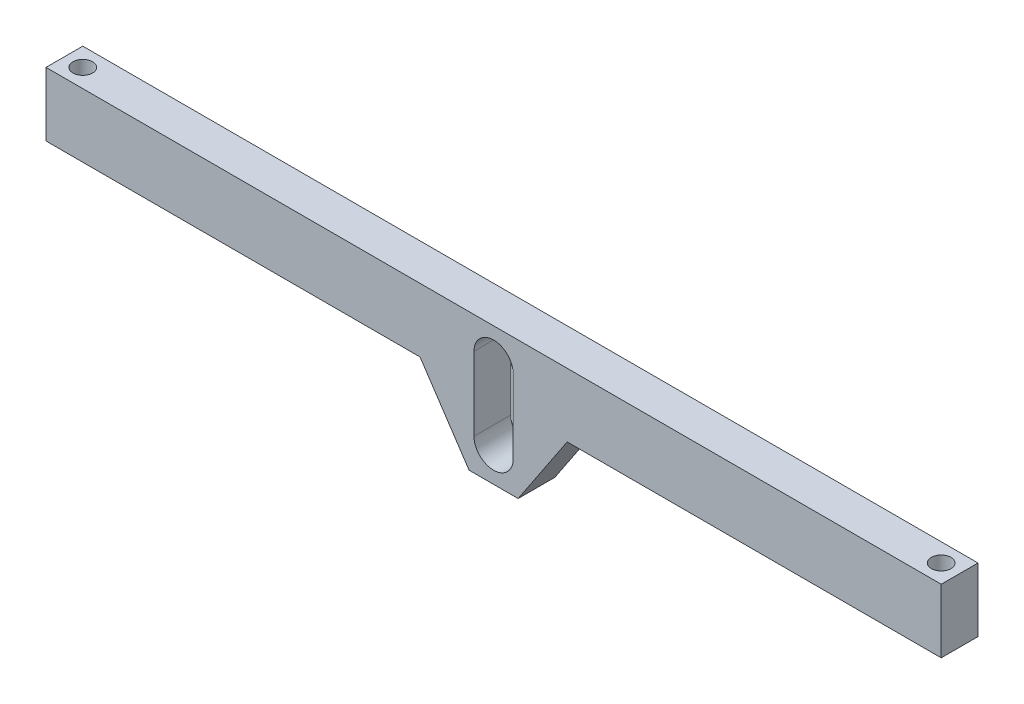
ISO-10303-21;
HEADER;
FILE_DESCRIPTION(('STEP AP214'),'2;1');
FILE_NAME('part.step','',(''),(''),'','','');
FILE_SCHEMA(('AUTOMOTIVE_DESIGN { 1 0 10303 214 1 1 1 1 }'));
ENDSEC;
DATA;
#1=APPLICATION_CONTEXT('core data for automotive mechanical design processes');
#2=APPLICATION_PROTOCOL_DEFINITION('international standard','automotive_design',2000,#1);
#3=PRODUCT_CONTEXT('',#1,'mechanical');
#4=PRODUCT('Part','Part','',(#3));
#5=PRODUCT_RELATED_PRODUCT_CATEGORY('part','',(#4));
#6=PRODUCT_DEFINITION_FORMATION('','',#4);
#7=PRODUCT_DEFINITION_CONTEXT('part definition',#1,'design');
#8=PRODUCT_DEFINITION('design','',#6,#7);
#9=PRODUCT_DEFINITION_SHAPE('','',#8);
#10=(LENGTH_UNIT() NAMED_UNIT(*) SI_UNIT(.MILLI.,.METRE.));
#11=(NAMED_UNIT(*) PLANE_ANGLE_UNIT() SI_UNIT($,.RADIAN.));
#12=(NAMED_UNIT(*) SI_UNIT($,.STERADIAN.) SOLID_ANGLE_UNIT());
#13=UNCERTAINTY_MEASURE_WITH_UNIT(LENGTH_MEASURE(1.E-05),#10,'distance_accuracy_value','');
#14=(GEOMETRIC_REPRESENTATION_CONTEXT(3) GLOBAL_UNCERTAINTY_ASSIGNED_CONTEXT((#13)) GLOBAL_UNIT_ASSIGNED_CONTEXT((#10,
#11,#12)) REPRESENTATION_CONTEXT('',''));
#15=CARTESIAN_POINT('',(0.,0.,0.));
#16=DIRECTION('',(0.,0.,1.));
#17=DIRECTION('',(1.,0.,0.));
#18=AXIS2_PLACEMENT_3D('',#15,#16,#17);
#19=CARTESIAN_POINT('',(-12.2207001177359,4.39098069496649,3.));
#20=DIRECTION('',(0.,0.,-1.));
#21=DIRECTION('',(-1.,0.,0.));
#22=AXIS2_PLACEMENT_3D('',#19,#20,#21);
#23=CYLINDRICAL_SURFACE('',#22,1.6);
#24=CARTESIAN_POINT('',(-12.2207001177359,4.39098069496649,0.));
#25=DIRECTION('',(0.,0.,1.));
#26=DIRECTION('',(1.,0.,0.));
#27=AXIS2_PLACEMENT_3D('',#24,#25,#26);
#28=CIRCLE('',#27,1.6);
#29=CARTESIAN_POINT('',(-10.6207001177358,4.39098069496649,0.));
#30=VERTEX_POINT('',#29);
#31=CARTESIAN_POINT('',(-13.8207001177359,4.39098069496649,0.));
#32=VERTEX_POINT('',#31);
#33=EDGE_CURVE('E177',#30,#32,#28,.T.);
#34=ORIENTED_EDGE('',*,*,#33,.F.);
#35=DIRECTION('',(0.,0.,-1.));
#36=VECTOR('',#35,1.);
#37=CARTESIAN_POINT('',(-10.6207001177358,4.39098069496649,3.));
#38=LINE('',#37,#36);
#39=CARTESIAN_POINT('',(-10.6207001177358,4.39098069496649,3.));
#40=VERTEX_POINT('',#39);
#41=EDGE_CURVE('E11',#40,#30,#38,.T.);
#42=ORIENTED_EDGE('',*,*,#41,.F.);
#43=CARTESIAN_POINT('',(-12.2207001177359,4.39098069496649,3.));
#44=DIRECTION('',(0.,0.,1.));
#45=DIRECTION('',(1.,0.,0.));
#46=AXIS2_PLACEMENT_3D('',#43,#44,#45);
#47=CIRCLE('',#46,1.6);
#48=CARTESIAN_POINT('',(-13.8207001177359,4.39098069496649,3.));
#49=VERTEX_POINT('',#48);
#50=EDGE_CURVE('E139',#40,#49,#47,.T.);
#51=ORIENTED_EDGE('',*,*,#50,.T.);
#52=DIRECTION('',(0.,0.,-1.));
#53=VECTOR('',#52,1.);
#54=CARTESIAN_POINT('',(-13.8207001177359,4.39098069496649,3.));
#55=LINE('',#54,#53);
#56=EDGE_CURVE('E100',#49,#32,#55,.T.);
#57=ORIENTED_EDGE('',*,*,#56,.T.);
#58=EDGE_LOOP('',(#34,#42,#51,#57));
#59=FACE_BOUND('',#58,.T.);
#60=ADVANCED_FACE('F35',(#59),#23,.F.);
#61=CARTESIAN_POINT('',(-10.6207001177359,0.,3.));
#62=DIRECTION('',(1.,0.,0.));
#63=DIRECTION('',(0.,1.,0.));
#64=AXIS2_PLACEMENT_3D('',#61,#62,#63);
#65=PLANE('',#64);
#66=DIRECTION('',(0.,-1.,0.));
#67=VECTOR('',#66,1.);
#68=CARTESIAN_POINT('',(-10.6207001177359,0.,0.));
#69=LINE('',#68,#67);
#70=CARTESIAN_POINT('',(-10.6207001177359,-1.60901930503351,0.));
#71=VERTEX_POINT('',#70);
#72=EDGE_CURVE('E145',#30,#71,#69,.T.);
#73=ORIENTED_EDGE('',*,*,#72,.T.);
#74=DIRECTION('',(0.,0.,-1.));
#75=VECTOR('',#74,1.);
#76=CARTESIAN_POINT('',(-10.6207001177359,-1.60901930503351,3.));
#77=LINE('',#76,#75);
#78=CARTESIAN_POINT('',(-10.6207001177359,-1.60901930503351,3.));
#79=VERTEX_POINT('',#78);
#80=EDGE_CURVE('E45',#79,#71,#77,.T.);
#81=ORIENTED_EDGE('',*,*,#80,.F.);
#82=DIRECTION('',(0.,-1.,0.));
#83=VECTOR('',#82,1.);
#84=CARTESIAN_POINT('',(-10.6207001177359,0.,3.));
#85=LINE('',#84,#83);
#86=EDGE_CURVE('E134',#40,#79,#85,.T.);
#87=ORIENTED_EDGE('',*,*,#86,.F.);
#88=ORIENTED_EDGE('',*,*,#41,.T.);
#89=EDGE_LOOP('',(#73,#81,#87,#88));
#90=FACE_BOUND('',#89,.T.);
#91=ADVANCED_FACE('F143',(#90),#65,.F.);
#92=CARTESIAN_POINT('',(-12.2207001177359,-1.60901930503351,3.));
#93=DIRECTION('',(0.,0.,-1.));
#94=DIRECTION('',(-1.,0.,0.));
#95=AXIS2_PLACEMENT_3D('',#92,#93,#94);
#96=CYLINDRICAL_SURFACE('',#95,1.6);
#97=CARTESIAN_POINT('',(-12.2207001177359,-1.60901930503351,0.));
#98=DIRECTION('',(0.,0.,1.));
#99=DIRECTION('',(1.,0.,0.));
#100=AXIS2_PLACEMENT_3D('',#97,#98,#99);
#101=CIRCLE('',#100,1.6);
#102=CARTESIAN_POINT('',(-13.8207001177359,-1.60901930503351,0.));
#103=VERTEX_POINT('',#102);
#104=EDGE_CURVE('E181',#103,#71,#101,.T.);
#105=ORIENTED_EDGE('',*,*,#104,.F.);
#106=DIRECTION('',(0.,0.,-1.));
#107=VECTOR('',#106,1.);
#108=CARTESIAN_POINT('',(-13.8207001177359,-1.60901930503351,3.));
#109=LINE('',#108,#107);
#110=CARTESIAN_POINT('',(-13.8207001177359,-1.60901930503351,3.));
#111=VERTEX_POINT('',#110);
#112=EDGE_CURVE('E93',#111,#103,#109,.T.);
#113=ORIENTED_EDGE('',*,*,#112,.F.);
#114=CARTESIAN_POINT('',(-12.2207001177359,-1.60901930503351,3.));
#115=DIRECTION('',(0.,0.,1.));
#116=DIRECTION('',(1.,0.,0.));
#117=AXIS2_PLACEMENT_3D('',#114,#115,#116);
#118=CIRCLE('',#117,1.6);
#119=EDGE_CURVE('E138',#111,#79,#118,.T.);
#120=ORIENTED_EDGE('',*,*,#119,.T.);
#121=ORIENTED_EDGE('',*,*,#80,.T.);
#122=EDGE_LOOP('',(#105,#113,#120,#121));
#123=FACE_BOUND('',#122,.T.);
#124=ADVANCED_FACE('F150',(#123),#96,.F.);
#125=CARTESIAN_POINT('',(-5.13324501764782,3.42216334509855,3.));
#126=DIRECTION('',(-0.832050294337844,0.554700196225229,0.));
#127=DIRECTION('',(-0.554700196225229,-0.832050294337844,0.));
#128=AXIS2_PLACEMENT_3D('',#125,#126,#127);
#129=PLANE('',#128);
#130=DIRECTION('',(0.554700196225229,0.832050294337844,0.));
#131=VECTOR('',#130,1.);
#132=CARTESIAN_POINT('',(-5.13324501764782,3.42216334509855,0.));
#133=LINE('',#132,#131);
#134=CARTESIAN_POINT('',(-10.2207001177359,-4.20901930503351,0.));
#135=VERTEX_POINT('',#134);
#136=CARTESIAN_POINT('',(-6.22070011773585,1.79098069496649,0.));
#137=VERTEX_POINT('',#136);
#138=EDGE_CURVE('E156',#135,#137,#133,.T.);
#139=ORIENTED_EDGE('',*,*,#138,.T.);
#140=DIRECTION('',(0.,0.,-1.));
#141=VECTOR('',#140,1.);
#142=CARTESIAN_POINT('',(-6.22070011773585,1.79098069496649,3.));
#143=LINE('',#142,#141);
#144=CARTESIAN_POINT('',(-6.22070011773585,1.79098069496649,3.));
#145=VERTEX_POINT('',#144);
#146=EDGE_CURVE('E39',#145,#137,#143,.T.);
#147=ORIENTED_EDGE('',*,*,#146,.F.);
#148=DIRECTION('',(0.554700196225229,0.832050294337844,0.));
#149=VECTOR('',#148,1.);
#150=CARTESIAN_POINT('',(-5.13324501764782,3.42216334509855,3.));
#151=LINE('',#150,#149);
#152=CARTESIAN_POINT('',(-10.2207001177359,-4.20901930503351,3.));
#153=VERTEX_POINT('',#152);
#154=EDGE_CURVE('E185',#153,#145,#151,.T.);
#155=ORIENTED_EDGE('',*,*,#154,.F.);
#156=DIRECTION('',(0.,0.,-1.));
#157=VECTOR('',#156,1.);
#158=CARTESIAN_POINT('',(-10.2207001177359,-4.20901930503351,3.));
#159=LINE('',#158,#157);
#160=EDGE_CURVE('E152',#153,#135,#159,.T.);
#161=ORIENTED_EDGE('',*,*,#160,.T.);
#162=EDGE_LOOP('',(#139,#147,#155,#161));
#163=FACE_BOUND('',#162,.T.);
#164=ADVANCED_FACE('F37',(#163),#129,.F.);
#165=CARTESIAN_POINT('',(0.,1.79098069496649,3.));
#166=DIRECTION('',(0.,1.,0.));
#167=DIRECTION('',(0.,0.,1.));
#168=AXIS2_PLACEMENT_3D('',#165,#166,#167);
#169=PLANE('',#168);
#170=CARTESIAN_POINT('',(22.7792998822641,1.79098069496649,1.5));
#171=DIRECTION('',(0.,-1.,0.));
#172=DIRECTION('',(0.,0.,-1.));
#173=AXIS2_PLACEMENT_3D('',#170,#171,#172);
#174=CIRCLE('',#173,0.799999999999999);
#175=CARTESIAN_POINT('',(22.7792998822641,1.79098069496649,0.700000000000001));
#176=VERTEX_POINT('',#175);
#177=EDGE_CURVE('E283',#176,#176,#174,.T.);
#178=ORIENTED_EDGE('',*,*,#177,.F.);
#179=EDGE_LOOP('',(#178));
#180=FACE_BOUND('',#179,.T.);
#181=DIRECTION('',(1.,0.,0.));
#182=VECTOR('',#181,1.);
#183=CARTESIAN_POINT('',(0.,1.79098069496649,0.));
#184=LINE('',#183,#182);
#185=CARTESIAN_POINT('',(24.2792998822641,1.79098069496649,0.));
#186=VERTEX_POINT('',#185);
#187=EDGE_CURVE('E159',#137,#186,#184,.T.);
#188=ORIENTED_EDGE('',*,*,#187,.T.);
#189=DIRECTION('',(0.,0.,-1.));
#190=VECTOR('',#189,1.);
#191=CARTESIAN_POINT('',(24.2792998822641,1.79098069496649,3.));
#192=LINE('',#191,#190);
#193=CARTESIAN_POINT('',(24.2792998822641,1.79098069496649,3.));
#194=VERTEX_POINT('',#193);
#195=EDGE_CURVE('E202',#194,#186,#192,.T.);
#196=ORIENTED_EDGE('',*,*,#195,.F.);
#197=DIRECTION('',(1.,0.,0.));
#198=VECTOR('',#197,1.);
#199=CARTESIAN_POINT('',(0.,1.79098069496649,3.));
#200=LINE('',#199,#198);
#201=EDGE_CURVE('E108',#145,#194,#200,.T.);
#202=ORIENTED_EDGE('',*,*,#201,.F.);
#203=ORIENTED_EDGE('',*,*,#146,.T.);
#204=EDGE_LOOP('',(#188,#196,#202,#203));
#205=FACE_BOUND('',#204,.T.);
#206=ADVANCED_FACE('F207',(#180,#205),#169,.F.);
#207=CARTESIAN_POINT('',(24.2792998822641,0.,3.));
#208=DIRECTION('',(1.,0.,0.));
#209=DIRECTION('',(0.,0.,-1.));
#210=AXIS2_PLACEMENT_3D('',#207,#208,#209);
#211=PLANE('',#210);
#212=DIRECTION('',(0.,-1.,0.));
#213=VECTOR('',#212,1.);
#214=CARTESIAN_POINT('',(24.2792998822641,0.,0.));
#215=LINE('',#214,#213);
#216=CARTESIAN_POINT('',(24.2792998822641,6.99098069496649,0.));
#217=VERTEX_POINT('',#216);
#218=EDGE_CURVE('E163',#217,#186,#215,.T.);
#219=ORIENTED_EDGE('',*,*,#218,.F.);
#220=DIRECTION('',(0.,0.,-1.));
#221=VECTOR('',#220,1.);
#222=CARTESIAN_POINT('',(24.2792998822641,6.99098069496649,3.));
#223=LINE('',#222,#221);
#224=CARTESIAN_POINT('',(24.2792998822641,6.99098069496649,3.));
#225=VERTEX_POINT('',#224);
#226=EDGE_CURVE('E201',#225,#217,#223,.T.);
#227=ORIENTED_EDGE('',*,*,#226,.F.);
#228=DIRECTION('',(0.,-1.,0.));
#229=VECTOR('',#228,1.);
#230=CARTESIAN_POINT('',(24.2792998822641,0.,3.));
#231=LINE('',#230,#229);
#232=EDGE_CURVE('E221',#225,#194,#231,.T.);
#233=ORIENTED_EDGE('',*,*,#232,.T.);
#234=ORIENTED_EDGE('',*,*,#195,.T.);
#235=EDGE_LOOP('',(#219,#227,#233,#234));
#236=FACE_BOUND('',#235,.T.);
#237=ADVANCED_FACE('F219',(#236),#211,.T.);
#238=CARTESIAN_POINT('',(0.,6.99098069496649,3.));
#239=DIRECTION('',(0.,1.,0.));
#240=DIRECTION('',(0.,0.,1.));
#241=AXIS2_PLACEMENT_3D('',#238,#239,#240);
#242=PLANE('',#241);
#243=CARTESIAN_POINT('',(-47.2207001177359,6.99098069496649,1.5));
#244=DIRECTION('',(0.,-1.,0.));
#245=DIRECTION('',(0.,0.,-1.));
#246=AXIS2_PLACEMENT_3D('',#243,#244,#245);
#247=CIRCLE('',#246,0.800000000000003);
#248=CARTESIAN_POINT('',(-47.2207001177359,6.99098069496649,0.699999999999997));
#249=VERTEX_POINT('',#248);
#250=EDGE_CURVE('E285',#249,#249,#247,.T.);
#251=ORIENTED_EDGE('',*,*,#250,.T.);
#252=EDGE_LOOP('',(#251));
#253=FACE_BOUND('',#252,.T.);
#254=CARTESIAN_POINT('',(22.7792998822641,6.99098069496649,1.5));
#255=DIRECTION('',(0.,-1.,0.));
#256=DIRECTION('',(0.,0.,-1.));
#257=AXIS2_PLACEMENT_3D('',#254,#255,#256);
#258=CIRCLE('',#257,0.799999999999999);
#259=CARTESIAN_POINT('',(22.7792998822641,6.99098069496649,0.700000000000001));
#260=VERTEX_POINT('',#259);
#261=EDGE_CURVE('E160',#260,#260,#258,.T.);
#262=ORIENTED_EDGE('',*,*,#261,.T.);
#263=EDGE_LOOP('',(#262));
#264=FACE_BOUND('',#263,.T.);
#265=DIRECTION('',(1.,0.,0.));
#266=VECTOR('',#265,1.);
#267=CARTESIAN_POINT('',(0.,6.99098069496649,0.));
#268=LINE('',#267,#266);
#269=CARTESIAN_POINT('',(-48.7207001177359,6.99098069496649,0.));
#270=VERTEX_POINT('',#269);
#271=EDGE_CURVE('E166',#270,#217,#268,.T.);
#272=ORIENTED_EDGE('',*,*,#271,.F.);
#273=DIRECTION('',(0.,0.,-1.));
#274=VECTOR('',#273,1.);
#275=CARTESIAN_POINT('',(-48.7207001177359,6.99098069496649,3.));
#276=LINE('',#275,#274);
#277=CARTESIAN_POINT('',(-48.7207001177359,6.99098069496649,3.));
#278=VERTEX_POINT('',#277);
#279=EDGE_CURVE('E199',#278,#270,#276,.T.);
#280=ORIENTED_EDGE('',*,*,#279,.F.);
#281=DIRECTION('',(1.,0.,0.));
#282=VECTOR('',#281,1.);
#283=CARTESIAN_POINT('',(0.,6.99098069496649,3.));
#284=LINE('',#283,#282);
#285=EDGE_CURVE('E226',#278,#225,#284,.T.);
#286=ORIENTED_EDGE('',*,*,#285,.T.);
#287=ORIENTED_EDGE('',*,*,#226,.T.);
#288=EDGE_LOOP('',(#272,#280,#286,#287));
#289=FACE_BOUND('',#288,.T.);
#290=ADVANCED_FACE('F228',(#253,#264,#289),#242,.T.);
#291=CARTESIAN_POINT('',(-48.7207001177359,0.,3.));
#292=DIRECTION('',(1.,0.,0.));
#293=DIRECTION('',(0.,0.,-1.));
#294=AXIS2_PLACEMENT_3D('',#291,#292,#293);
#295=PLANE('',#294);
#296=DIRECTION('',(0.,-1.,0.));
#297=VECTOR('',#296,1.);
#298=CARTESIAN_POINT('',(-48.7207001177359,0.,0.));
#299=LINE('',#298,#297);
#300=CARTESIAN_POINT('',(-48.7207001177359,1.79098069496649,0.));
#301=VERTEX_POINT('',#300);
#302=EDGE_CURVE('E169',#270,#301,#299,.T.);
#303=ORIENTED_EDGE('',*,*,#302,.T.);
#304=DIRECTION('',(0.,0.,-1.));
#305=VECTOR('',#304,1.);
#306=CARTESIAN_POINT('',(-48.7207001177359,1.79098069496649,3.));
#307=LINE('',#306,#305);
#308=CARTESIAN_POINT('',(-48.7207001177359,1.79098069496649,3.));
#309=VERTEX_POINT('',#308);
#310=EDGE_CURVE('E196',#309,#301,#307,.T.);
#311=ORIENTED_EDGE('',*,*,#310,.F.);
#312=DIRECTION('',(0.,-1.,0.));
#313=VECTOR('',#312,1.);
#314=CARTESIAN_POINT('',(-48.7207001177359,0.,3.));
#315=LINE('',#314,#313);
#316=EDGE_CURVE('E230',#278,#309,#315,.T.);
#317=ORIENTED_EDGE('',*,*,#316,.F.);
#318=ORIENTED_EDGE('',*,*,#279,.T.);
#319=EDGE_LOOP('',(#303,#311,#317,#318));
#320=FACE_BOUND('',#319,.T.);
#321=ADVANCED_FACE('F267',(#320),#295,.F.);
#322=CARTESIAN_POINT('',(0.,1.79098069496649,3.));
#323=DIRECTION('',(0.,1.,0.));
#324=DIRECTION('',(0.,0.,1.));
#325=AXIS2_PLACEMENT_3D('',#322,#323,#324);
#326=PLANE('',#325);
#327=CARTESIAN_POINT('',(-47.2207001177359,1.79098069496649,1.5));
#328=DIRECTION('',(0.,-1.,0.));
#329=DIRECTION('',(0.,0.,-1.));
#330=AXIS2_PLACEMENT_3D('',#327,#328,#329);
#331=CIRCLE('',#330,0.800000000000003);
#332=CARTESIAN_POINT('',(-47.2207001177359,1.79098069496649,0.699999999999997));
#333=VERTEX_POINT('',#332);
#334=EDGE_CURVE('E290',#333,#333,#331,.T.);
#335=ORIENTED_EDGE('',*,*,#334,.F.);
#336=EDGE_LOOP('',(#335));
#337=FACE_BOUND('',#336,.T.);
#338=DIRECTION('',(1.,0.,0.));
#339=VECTOR('',#338,1.);
#340=CARTESIAN_POINT('',(0.,1.79098069496649,0.));
#341=LINE('',#340,#339);
#342=CARTESIAN_POINT('',(-18.2207001177359,1.7909806949665,0.));
#343=VERTEX_POINT('',#342);
#344=EDGE_CURVE('E171',#301,#343,#341,.T.);
#345=ORIENTED_EDGE('',*,*,#344,.T.);
#346=DIRECTION('',(0.,0.,-1.));
#347=VECTOR('',#346,1.);
#348=CARTESIAN_POINT('',(-18.2207001177359,1.7909806949665,3.));
#349=LINE('',#348,#347);
#350=CARTESIAN_POINT('',(-18.2207001177359,1.7909806949665,3.));
#351=VERTEX_POINT('',#350);
#352=EDGE_CURVE('E193',#351,#343,#349,.T.);
#353=ORIENTED_EDGE('',*,*,#352,.F.);
#354=DIRECTION('',(1.,0.,0.));
#355=VECTOR('',#354,1.);
#356=CARTESIAN_POINT('',(0.,1.79098069496649,3.));
#357=LINE('',#356,#355);
#358=EDGE_CURVE('E232',#309,#351,#357,.T.);
#359=ORIENTED_EDGE('',*,*,#358,.F.);
#360=ORIENTED_EDGE('',*,*,#310,.T.);
#361=EDGE_LOOP('',(#345,#353,#359,#360));
#362=FACE_BOUND('',#361,.T.);
#363=ADVANCED_FACE('F263',(#337,#362),#326,.F.);
#364=CARTESIAN_POINT('',(-11.7877243761403,-7.85848291742686,3.));
#365=DIRECTION('',(0.832050294337843,0.554700196225229,0.));
#366=DIRECTION('',(-0.554700196225229,0.832050294337844,0.));
#367=AXIS2_PLACEMENT_3D('',#364,#365,#366);
#368=PLANE('',#367);
#369=DIRECTION('',(0.554700196225229,-0.832050294337844,0.));
#370=VECTOR('',#369,1.);
#371=CARTESIAN_POINT('',(-11.7877243761403,-7.85848291742686,0.));
#372=LINE('',#371,#370);
#373=CARTESIAN_POINT('',(-14.2207001177359,-4.2090193050335,0.));
#374=VERTEX_POINT('',#373);
#375=EDGE_CURVE('E173',#343,#374,#372,.T.);
#376=ORIENTED_EDGE('',*,*,#375,.T.);
#377=DIRECTION('',(0.,0.,-1.));
#378=VECTOR('',#377,1.);
#379=CARTESIAN_POINT('',(-14.2207001177359,-4.2090193050335,3.));
#380=LINE('',#379,#378);
#381=CARTESIAN_POINT('',(-14.2207001177359,-4.2090193050335,3.));
#382=VERTEX_POINT('',#381);
#383=EDGE_CURVE('E190',#382,#374,#380,.T.);
#384=ORIENTED_EDGE('',*,*,#383,.F.);
#385=DIRECTION('',(0.554700196225229,-0.832050294337844,0.));
#386=VECTOR('',#385,1.);
#387=CARTESIAN_POINT('',(-11.7877243761403,-7.85848291742686,3.));
#388=LINE('',#387,#386);
#389=EDGE_CURVE('E237',#351,#382,#388,.T.);
#390=ORIENTED_EDGE('',*,*,#389,.F.);
#391=ORIENTED_EDGE('',*,*,#352,.T.);
#392=EDGE_LOOP('',(#376,#384,#390,#391));
#393=FACE_BOUND('',#392,.T.);
#394=ADVANCED_FACE('F249',(#393),#368,.F.);
#395=CARTESIAN_POINT('',(0.,-4.20901930503351,3.));
#396=DIRECTION('',(0.,1.,0.));
#397=DIRECTION('',(-1.,0.,0.));
#398=AXIS2_PLACEMENT_3D('',#395,#396,#397);
#399=PLANE('',#398);
#400=DIRECTION('',(1.,0.,0.));
#401=VECTOR('',#400,1.);
#402=CARTESIAN_POINT('',(0.,-4.20901930503351,0.));
#403=LINE('',#402,#401);
#404=EDGE_CURVE('E175',#374,#135,#403,.T.);
#405=ORIENTED_EDGE('',*,*,#404,.T.);
#406=ORIENTED_EDGE('',*,*,#160,.F.);
#407=DIRECTION('',(1.,0.,0.));
#408=VECTOR('',#407,1.);
#409=CARTESIAN_POINT('',(0.,-4.20901930503351,3.));
#410=LINE('',#409,#408);
#411=EDGE_CURVE('E239',#382,#153,#410,.T.);
#412=ORIENTED_EDGE('',*,*,#411,.F.);
#413=ORIENTED_EDGE('',*,*,#383,.T.);
#414=EDGE_LOOP('',(#405,#406,#412,#413));
#415=FACE_BOUND('',#414,.T.);
#416=ADVANCED_FACE('F242',(#415),#399,.F.);
#417=CARTESIAN_POINT('',(-13.8207001177359,0.,3.));
#418=DIRECTION('',(-1.,0.,0.));
#419=DIRECTION('',(0.,-1.,0.));
#420=AXIS2_PLACEMENT_3D('',#417,#418,#419);
#421=PLANE('',#420);
#422=DIRECTION('',(0.,1.,0.));
#423=VECTOR('',#422,1.);
#424=CARTESIAN_POINT('',(-13.8207001177359,0.,0.));
#425=LINE('',#424,#423);
#426=EDGE_CURVE('E183',#103,#32,#425,.T.);
#427=ORIENTED_EDGE('',*,*,#426,.T.);
#428=ORIENTED_EDGE('',*,*,#56,.F.);
#429=DIRECTION('',(0.,1.,0.));
#430=VECTOR('',#429,1.);
#431=CARTESIAN_POINT('',(-13.8207001177359,0.,3.));
#432=LINE('',#431,#430);
#433=EDGE_CURVE('E54',#111,#49,#432,.T.);
#434=ORIENTED_EDGE('',*,*,#433,.F.);
#435=ORIENTED_EDGE('',*,*,#112,.T.);
#436=EDGE_LOOP('',(#427,#428,#434,#435));
#437=FACE_BOUND('',#436,.T.);
#438=ADVANCED_FACE('F240',(#437),#421,.F.);
#439=CARTESIAN_POINT('',(0.,0.,3.));
#440=DIRECTION('',(0.,0.,1.));
#441=DIRECTION('',(1.,0.,0.));
#442=AXIS2_PLACEMENT_3D('',#439,#440,#441);
#443=PLANE('',#442);
#444=ORIENTED_EDGE('',*,*,#154,.T.);
#445=ORIENTED_EDGE('',*,*,#201,.T.);
#446=ORIENTED_EDGE('',*,*,#232,.F.);
#447=ORIENTED_EDGE('',*,*,#285,.F.);
#448=ORIENTED_EDGE('',*,*,#316,.T.);
#449=ORIENTED_EDGE('',*,*,#358,.T.);
#450=ORIENTED_EDGE('',*,*,#389,.T.);
#451=ORIENTED_EDGE('',*,*,#411,.T.);
#452=EDGE_LOOP('',(#444,#445,#446,#447,#448,#449,#450,#451));
#453=FACE_BOUND('',#452,.T.);
#454=ORIENTED_EDGE('',*,*,#50,.F.);
#455=ORIENTED_EDGE('',*,*,#86,.T.);
#456=ORIENTED_EDGE('',*,*,#119,.F.);
#457=ORIENTED_EDGE('',*,*,#433,.T.);
#458=EDGE_LOOP('',(#454,#455,#456,#457));
#459=FACE_BOUND('',#458,.T.);
#460=ADVANCED_FACE('F136',(#453,#459),#443,.T.);
#461=CARTESIAN_POINT('',(0.,0.,0.));
#462=DIRECTION('',(0.,0.,1.));
#463=DIRECTION('',(1.,0.,0.));
#464=AXIS2_PLACEMENT_3D('',#461,#462,#463);
#465=PLANE('',#464);
#466=ORIENTED_EDGE('',*,*,#138,.F.);
#467=ORIENTED_EDGE('',*,*,#404,.F.);
#468=ORIENTED_EDGE('',*,*,#375,.F.);
#469=ORIENTED_EDGE('',*,*,#344,.F.);
#470=ORIENTED_EDGE('',*,*,#302,.F.);
#471=ORIENTED_EDGE('',*,*,#271,.T.);
#472=ORIENTED_EDGE('',*,*,#218,.T.);
#473=ORIENTED_EDGE('',*,*,#187,.F.);
#474=EDGE_LOOP('',(#466,#467,#468,#469,#470,#471,#472,#473));
#475=FACE_BOUND('',#474,.T.);
#476=ORIENTED_EDGE('',*,*,#33,.T.);
#477=ORIENTED_EDGE('',*,*,#426,.F.);
#478=ORIENTED_EDGE('',*,*,#104,.T.);
#479=ORIENTED_EDGE('',*,*,#72,.F.);
#480=EDGE_LOOP('',(#476,#477,#478,#479));
#481=FACE_BOUND('',#480,.T.);
#482=ADVANCED_FACE('F214',(#475,#481),#465,.F.);
#483=CARTESIAN_POINT('',(22.7792998822641,6.99098069496649,1.5));
#484=DIRECTION('',(0.,-1.,0.));
#485=DIRECTION('',(0.,0.,-1.));
#486=AXIS2_PLACEMENT_3D('',#483,#484,#485);
#487=CYLINDRICAL_SURFACE('',#486,0.799999999999999);
#488=ORIENTED_EDGE('',*,*,#261,.F.);
#489=EDGE_LOOP('',(#488));
#490=FACE_BOUND('',#489,.T.);
#491=ORIENTED_EDGE('',*,*,#177,.T.);
#492=EDGE_LOOP('',(#491));
#493=FACE_BOUND('',#492,.T.);
#494=ADVANCED_FACE('F307',(#490,#493),#487,.F.);
#495=CARTESIAN_POINT('',(-47.2207001177359,6.99098069496649,1.5));
#496=DIRECTION('',(0.,-1.,0.));
#497=DIRECTION('',(0.,0.,-1.));
#498=AXIS2_PLACEMENT_3D('',#495,#496,#497);
#499=CYLINDRICAL_SURFACE('',#498,0.800000000000003);
#500=ORIENTED_EDGE('',*,*,#250,.F.);
#501=EDGE_LOOP('',(#500));
#502=FACE_BOUND('',#501,.T.);
#503=ORIENTED_EDGE('',*,*,#334,.T.);
#504=EDGE_LOOP('',(#503));
#505=FACE_BOUND('',#504,.T.);
#506=ADVANCED_FACE('F305',(#502,#505),#499,.F.);
#507=CLOSED_SHELL('',(#60,#91,#124,#164,#206,#237,#290,#321,#363,#394,#416,#438,#460,#482,#494,#506));
#508=MANIFOLD_SOLID_BREP('B2',#507);
#509=ADVANCED_BREP_SHAPE_REPRESENTATION('',(#18,#508),#14);
#510=SHAPE_DEFINITION_REPRESENTATION(#9,#509);
ENDSEC;
END-ISO-10303-21;
